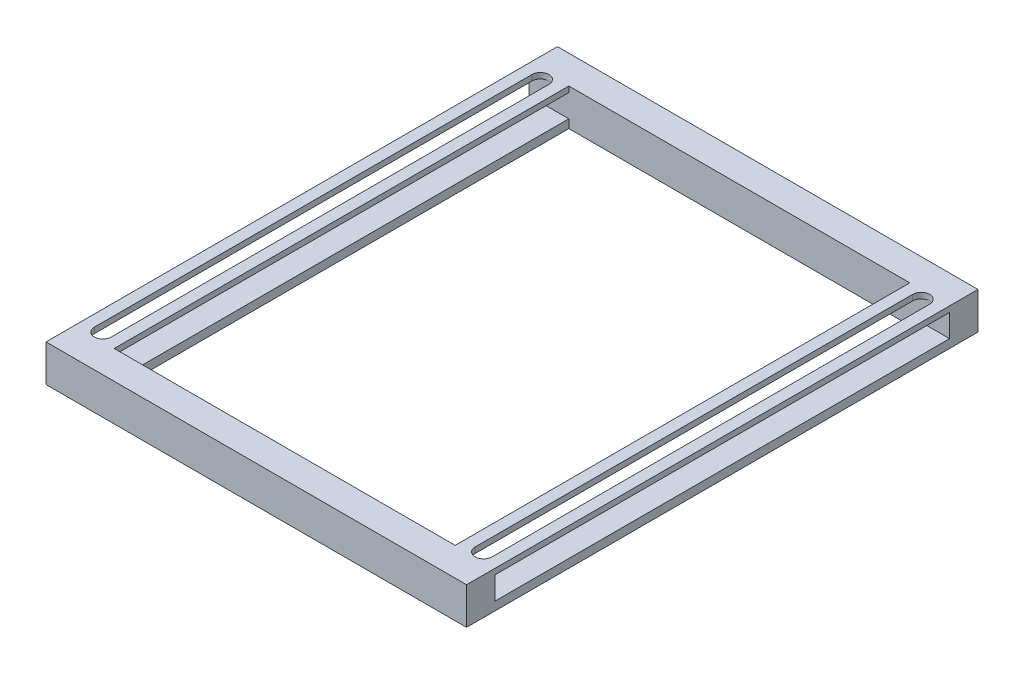
ISO-10303-21;
HEADER;
FILE_DESCRIPTION(('STEP AP214'),'2;1');
FILE_NAME('part.step','',(''),(''),'','','');
FILE_SCHEMA(('AUTOMOTIVE_DESIGN { 1 0 10303 214 1 1 1 1 }'));
ENDSEC;
DATA;
#1=APPLICATION_CONTEXT('core data for automotive mechanical design processes');
#2=APPLICATION_PROTOCOL_DEFINITION('international standard','automotive_design',2000,#1);
#3=PRODUCT_CONTEXT('',#1,'mechanical');
#4=PRODUCT('Part','Part','',(#3));
#5=PRODUCT_RELATED_PRODUCT_CATEGORY('part','',(#4));
#6=PRODUCT_DEFINITION_FORMATION('','',#4);
#7=PRODUCT_DEFINITION_CONTEXT('part definition',#1,'design');
#8=PRODUCT_DEFINITION('design','',#6,#7);
#9=PRODUCT_DEFINITION_SHAPE('','',#8);
#10=(LENGTH_UNIT() NAMED_UNIT(*) SI_UNIT(.MILLI.,.METRE.));
#11=(NAMED_UNIT(*) PLANE_ANGLE_UNIT() SI_UNIT($,.RADIAN.));
#12=(NAMED_UNIT(*) SI_UNIT($,.STERADIAN.) SOLID_ANGLE_UNIT());
#13=UNCERTAINTY_MEASURE_WITH_UNIT(LENGTH_MEASURE(1.E-05),#10,'distance_accuracy_value','');
#14=(GEOMETRIC_REPRESENTATION_CONTEXT(3) GLOBAL_UNCERTAINTY_ASSIGNED_CONTEXT((#13)) GLOBAL_UNIT_ASSIGNED_CONTEXT((#10,
#11,#12)) REPRESENTATION_CONTEXT('',''));
#15=CARTESIAN_POINT('',(0.,0.,0.));
#16=DIRECTION('',(0.,0.,1.));
#17=DIRECTION('',(1.,0.,0.));
#18=AXIS2_PLACEMENT_3D('',#15,#16,#17);
#19=CARTESIAN_POINT('',(0.,-3.,0.));
#20=DIRECTION('',(0.,1.,0.));
#21=DIRECTION('',(0.,0.,1.));
#22=AXIS2_PLACEMENT_3D('',#19,#20,#21);
#23=PLANE('',#22);
#24=DIRECTION('',(-1.,0.,0.));
#25=VECTOR('',#24,1.);
#26=CARTESIAN_POINT('',(158.404053839008,-3.,-6.54809358752482));
#27=LINE('',#26,#25);
#28=CARTESIAN_POINT('',(159.40405383901,-3.,-6.54809358752166));
#29=VERTEX_POINT('',#28);
#30=CARTESIAN_POINT('',(11.4040538390096,-3.,-6.54809358752166));
#31=VERTEX_POINT('',#30);
#32=EDGE_CURVE('E423',#29,#31,#27,.T.);
#33=ORIENTED_EDGE('',*,*,#32,.T.);
#34=DIRECTION('',(0.,0.,1.));
#35=VECTOR('',#34,1.);
#36=CARTESIAN_POINT('',(11.4040538390096,-3.,0.));
#37=LINE('',#36,#35);
#38=CARTESIAN_POINT('',(11.4040538390089,-3.,-186.548093587522));
#39=VERTEX_POINT('',#38);
#40=EDGE_CURVE('E400',#39,#31,#37,.T.);
#41=ORIENTED_EDGE('',*,*,#40,.F.);
#42=DIRECTION('',(-1.,0.,0.));
#43=VECTOR('',#42,1.);
#44=CARTESIAN_POINT('',(158.404053839008,-3.,-186.548093587522));
#45=LINE('',#44,#43);
#46=CARTESIAN_POINT('',(159.40405383901,-3.,-186.548093587522));
#47=VERTEX_POINT('',#46);
#48=EDGE_CURVE('E416',#47,#39,#45,.T.);
#49=ORIENTED_EDGE('',*,*,#48,.F.);
#50=DIRECTION('',(0.,0.,-1.));
#51=VECTOR('',#50,1.);
#52=CARTESIAN_POINT('',(159.40405383901,-3.,0.));
#53=LINE('',#52,#51);
#54=EDGE_CURVE('E367',#29,#47,#53,.T.);
#55=ORIENTED_EDGE('',*,*,#54,.F.);
#56=EDGE_LOOP('',(#33,#41,#49,#55));
#57=FACE_BOUND('',#56,.T.);
#58=DIRECTION('',(0.,0.,1.));
#59=VECTOR('',#58,1.);
#60=CARTESIAN_POINT('',(145.40405383901,-3.,-176.548093587522));
#61=LINE('',#60,#59);
#62=CARTESIAN_POINT('',(145.40405383901,-3.,-176.548093587522));
#63=VERTEX_POINT('',#62);
#64=CARTESIAN_POINT('',(145.40405383901,-3.,-16.5480935875216));
#65=VERTEX_POINT('',#64);
#66=EDGE_CURVE('E356',#63,#65,#61,.T.);
#67=ORIENTED_EDGE('',*,*,#66,.F.);
#68=DIRECTION('',(-1.,0.,0.));
#69=VECTOR('',#68,1.);
#70=CARTESIAN_POINT('',(146.404053839008,-3.,-176.548093587522));
#71=LINE('',#70,#69);
#72=CARTESIAN_POINT('',(25.4040538390096,-3.,-176.548093587522));
#73=VERTEX_POINT('',#72);
#74=EDGE_CURVE('E418',#63,#73,#71,.T.);
#75=ORIENTED_EDGE('',*,*,#74,.T.);
#76=DIRECTION('',(0.,0.,-1.));
#77=VECTOR('',#76,1.);
#78=CARTESIAN_POINT('',(25.4040538390096,-3.,-16.5480935875217));
#79=LINE('',#78,#77);
#80=CARTESIAN_POINT('',(25.4040538390096,-3.,-16.5480935875217));
#81=VERTEX_POINT('',#80);
#82=EDGE_CURVE('E333',#81,#73,#79,.T.);
#83=ORIENTED_EDGE('',*,*,#82,.F.);
#84=DIRECTION('',(-1.,0.,0.));
#85=VECTOR('',#84,1.);
#86=CARTESIAN_POINT('',(158.404053839008,-3.,-16.5480935875217));
#87=LINE('',#86,#85);
#88=EDGE_CURVE('E421',#65,#81,#87,.T.);
#89=ORIENTED_EDGE('',*,*,#88,.F.);
#90=EDGE_LOOP('',(#67,#75,#83,#89));
#91=FACE_BOUND('',#90,.T.);
#92=DIRECTION('',(-1.,0.,0.));
#93=VECTOR('',#92,1.);
#94=CARTESIAN_POINT('',(20.9040538390079,-3.,-41.5480935875434));
#95=LINE('',#94,#93);
#96=CARTESIAN_POINT('',(20.9040538390079,-3.,-41.5480935875434));
#97=VERTEX_POINT('',#96);
#98=CARTESIAN_POINT('',(15.9040538390079,-3.,-41.5480935875434));
#99=VERTEX_POINT('',#98);
#100=EDGE_CURVE('E301',#97,#99,#95,.T.);
#101=ORIENTED_EDGE('',*,*,#100,.F.);
#102=DIRECTION('',(0.,0.,-1.));
#103=VECTOR('',#102,1.);
#104=CARTESIAN_POINT('',(20.9040538390079,-3.,-41.5480935875434));
#105=LINE('',#104,#103);
#106=CARTESIAN_POINT('',(20.9040538390079,-3.,-151.548093587559));
#107=VERTEX_POINT('',#106);
#108=EDGE_CURVE('E282',#97,#107,#105,.T.);
#109=ORIENTED_EDGE('',*,*,#108,.T.);
#110=DIRECTION('',(-1.,0.,0.));
#111=VECTOR('',#110,1.);
#112=CARTESIAN_POINT('',(20.9040538390079,-3.,-151.548093587559));
#113=LINE('',#112,#111);
#114=CARTESIAN_POINT('',(15.9040538390079,-3.,-151.548093587559));
#115=VERTEX_POINT('',#114);
#116=EDGE_CURVE('E285',#107,#115,#113,.T.);
#117=ORIENTED_EDGE('',*,*,#116,.T.);
#118=DIRECTION('',(0.,0.,-1.));
#119=VECTOR('',#118,1.);
#120=CARTESIAN_POINT('',(15.9040538390079,-3.,-41.5480935875434));
#121=LINE('',#120,#119);
#122=EDGE_CURVE('E60',#99,#115,#121,.T.);
#123=ORIENTED_EDGE('',*,*,#122,.F.);
#124=EDGE_LOOP('',(#101,#109,#117,#123));
#125=FACE_BOUND('',#124,.T.);
#126=DIRECTION('',(0.,0.,1.));
#127=VECTOR('',#126,1.);
#128=CARTESIAN_POINT('',(154.904053839023,-3.,-151.548093587559));
#129=LINE('',#128,#127);
#130=CARTESIAN_POINT('',(154.904053839023,-3.,-151.548093587559));
#131=VERTEX_POINT('',#130);
#132=CARTESIAN_POINT('',(154.904053839023,-3.,-41.5480935875434));
#133=VERTEX_POINT('',#132);
#134=EDGE_CURVE('E265',#131,#133,#129,.T.);
#135=ORIENTED_EDGE('',*,*,#134,.F.);
#136=DIRECTION('',(-1.,0.,0.));
#137=VECTOR('',#136,1.);
#138=CARTESIAN_POINT('',(154.904053839023,-3.,-151.548093587559));
#139=LINE('',#138,#137);
#140=CARTESIAN_POINT('',(149.904053839023,-3.,-151.548093587559));
#141=VERTEX_POINT('',#140);
#142=EDGE_CURVE('E276',#131,#141,#139,.T.);
#143=ORIENTED_EDGE('',*,*,#142,.T.);
#144=DIRECTION('',(0.,0.,1.));
#145=VECTOR('',#144,1.);
#146=CARTESIAN_POINT('',(149.904053839023,-3.,-151.548093587559));
#147=LINE('',#146,#145);
#148=CARTESIAN_POINT('',(149.904053839023,-3.,-41.5480935875434));
#149=VERTEX_POINT('',#148);
#150=EDGE_CURVE('E52',#141,#149,#147,.T.);
#151=ORIENTED_EDGE('',*,*,#150,.T.);
#152=DIRECTION('',(-1.,0.,0.));
#153=VECTOR('',#152,1.);
#154=CARTESIAN_POINT('',(154.904053839023,-3.,-41.5480935875434));
#155=LINE('',#154,#153);
#156=EDGE_CURVE('E281',#133,#149,#155,.T.);
#157=ORIENTED_EDGE('',*,*,#156,.F.);
#158=EDGE_LOOP('',(#135,#143,#151,#157));
#159=FACE_BOUND('',#158,.T.);
#160=ADVANCED_FACE('F37',(#57,#91,#125,#159),#23,.F.);
#161=CARTESIAN_POINT('',(24.4040538390096,10.,-16.5480935875217));
#162=DIRECTION('',(0.,0.,-1.));
#163=DIRECTION('',(-1.,0.,0.));
#164=AXIS2_PLACEMENT_3D('',#161,#162,#163);
#165=PLANE('',#164);
#166=DIRECTION('',(1.,0.,0.));
#167=VECTOR('',#166,1.);
#168=CARTESIAN_POINT('',(-41.5959461609905,8.,-16.5480935875217));
#169=LINE('',#168,#167);
#170=CARTESIAN_POINT('',(18.4040538390095,8.,-16.5480935875217));
#171=VERTEX_POINT('',#170);
#172=CARTESIAN_POINT('',(25.4040538390096,8.,-16.5480935875217));
#173=VERTEX_POINT('',#172);
#174=EDGE_CURVE('E617',#171,#173,#169,.T.);
#175=ORIENTED_EDGE('',*,*,#174,.T.);
#176=DIRECTION('',(0.,-1.,0.));
#177=VECTOR('',#176,1.);
#178=CARTESIAN_POINT('',(25.4040538390096,10.,-16.5480935875217));
#179=LINE('',#178,#177);
#180=CARTESIAN_POINT('',(25.4040538390096,10.,-16.5480935875217));
#181=VERTEX_POINT('',#180);
#182=EDGE_CURVE('E327',#181,#173,#179,.T.);
#183=ORIENTED_EDGE('',*,*,#182,.F.);
#184=DIRECTION('',(1.,0.,0.));
#185=VECTOR('',#184,1.);
#186=CARTESIAN_POINT('',(24.4040538390096,10.,-16.5480935875217));
#187=LINE('',#186,#185);
#188=CARTESIAN_POINT('',(145.40405383901,10.,-16.5480935875217));
#189=VERTEX_POINT('',#188);
#190=EDGE_CURVE('E504',#181,#189,#187,.T.);
#191=ORIENTED_EDGE('',*,*,#190,.T.);
#192=DIRECTION('',(0.,1.,0.));
#193=VECTOR('',#192,1.);
#194=CARTESIAN_POINT('',(145.40405383901,8.,-16.5480935875217));
#195=LINE('',#194,#193);
#196=CARTESIAN_POINT('',(145.40405383901,8.,-16.5480935875217));
#197=VERTEX_POINT('',#196);
#198=EDGE_CURVE('E344',#197,#189,#195,.T.);
#199=ORIENTED_EDGE('',*,*,#198,.F.);
#200=CARTESIAN_POINT('',(152.40405383901,8.,-16.5480935875217));
#201=VERTEX_POINT('',#200);
#202=EDGE_CURVE('E435',#197,#201,#169,.T.);
#203=ORIENTED_EDGE('',*,*,#202,.T.);
#204=CARTESIAN_POINT('',(159.40405383901,8.,-16.5480935875217));
#205=VERTEX_POINT('',#204);
#206=EDGE_CURVE('E433',#201,#205,#169,.T.);
#207=ORIENTED_EDGE('',*,*,#206,.T.);
#208=DIRECTION('',(0.,-1.,0.));
#209=VECTOR('',#208,1.);
#210=CARTESIAN_POINT('',(159.40405383901,0.,-16.5480935875217));
#211=LINE('',#210,#209);
#212=CARTESIAN_POINT('',(159.40405383901,0.,-16.5480935875217));
#213=VERTEX_POINT('',#212);
#214=EDGE_CURVE('E379',#205,#213,#211,.T.);
#215=ORIENTED_EDGE('',*,*,#214,.T.);
#216=DIRECTION('',(-1.,0.,0.));
#217=VECTOR('',#216,1.);
#218=CARTESIAN_POINT('',(158.40405383901,0.,-16.5480935875216));
#219=LINE('',#218,#217);
#220=CARTESIAN_POINT('',(145.40405383901,0.,-16.5480935875217));
#221=VERTEX_POINT('',#220);
#222=EDGE_CURVE('E414',#213,#221,#219,.T.);
#223=ORIENTED_EDGE('',*,*,#222,.T.);
#224=DIRECTION('',(0.,1.,0.));
#225=VECTOR('',#224,1.);
#226=CARTESIAN_POINT('',(145.40405383901,-3.,-16.5480935875216));
#227=LINE('',#226,#225);
#228=EDGE_CURVE('E358',#65,#221,#227,.T.);
#229=ORIENTED_EDGE('',*,*,#228,.F.);
#230=ORIENTED_EDGE('',*,*,#88,.T.);
#231=DIRECTION('',(0.,-1.,0.));
#232=VECTOR('',#231,1.);
#233=CARTESIAN_POINT('',(25.4040538390096,0.,-16.5480935875217));
#234=LINE('',#233,#232);
#235=CARTESIAN_POINT('',(25.4040538390096,0.,-16.5480935875217));
#236=VERTEX_POINT('',#235);
#237=EDGE_CURVE('E330',#236,#81,#234,.T.);
#238=ORIENTED_EDGE('',*,*,#237,.F.);
#239=DIRECTION('',(1.,0.,0.));
#240=VECTOR('',#239,1.);
#241=CARTESIAN_POINT('',(12.4040538390096,0.,-16.5480935875217));
#242=LINE('',#241,#240);
#243=CARTESIAN_POINT('',(11.4040538390095,0.,-16.5480935875217));
#244=VERTEX_POINT('',#243);
#245=EDGE_CURVE('E412',#244,#236,#242,.T.);
#246=ORIENTED_EDGE('',*,*,#245,.F.);
#247=DIRECTION('',(0.,-1.,0.));
#248=VECTOR('',#247,1.);
#249=CARTESIAN_POINT('',(11.4040538390095,0.,-16.5480935875217));
#250=LINE('',#249,#248);
#251=CARTESIAN_POINT('',(11.4040538390095,8.,-16.5480935875217));
#252=VERTEX_POINT('',#251);
#253=EDGE_CURVE('E388',#252,#244,#250,.T.);
#254=ORIENTED_EDGE('',*,*,#253,.F.);
#255=EDGE_CURVE('E431',#252,#171,#169,.T.);
#256=ORIENTED_EDGE('',*,*,#255,.T.);
#257=EDGE_LOOP('',(#175,#183,#191,#199,#203,#207,#215,#223,#229,#230,#238,#246,#254,#256));
#258=FACE_BOUND('',#257,.T.);
#259=ADVANCED_FACE('F537',(#258),#165,.T.);
#260=CARTESIAN_POINT('',(24.4040538390096,10.,-176.548093587522));
#261=DIRECTION('',(0.,0.,1.));
#262=DIRECTION('',(1.,0.,0.));
#263=AXIS2_PLACEMENT_3D('',#260,#261,#262);
#264=PLANE('',#263);
#265=DIRECTION('',(0.,1.,0.));
#266=VECTOR('',#265,1.);
#267=CARTESIAN_POINT('',(25.4040538390096,8.,-176.548093587522));
#268=LINE('',#267,#266);
#269=CARTESIAN_POINT('',(25.4040538390096,8.,-176.548093587522));
#270=VERTEX_POINT('',#269);
#271=CARTESIAN_POINT('',(25.4040538390096,10.,-176.548093587522));
#272=VERTEX_POINT('',#271);
#273=EDGE_CURVE('E322',#270,#272,#268,.T.);
#274=ORIENTED_EDGE('',*,*,#273,.F.);
#275=DIRECTION('',(1.,0.,0.));
#276=VECTOR('',#275,1.);
#277=CARTESIAN_POINT('',(-41.5959461609905,8.,-176.548093587522));
#278=LINE('',#277,#276);
#279=CARTESIAN_POINT('',(18.4040538390093,8.,-176.548093587522));
#280=VERTEX_POINT('',#279);
#281=EDGE_CURVE('E596',#280,#270,#278,.T.);
#282=ORIENTED_EDGE('',*,*,#281,.F.);
#283=CARTESIAN_POINT('',(11.404053839009,8.,-176.548093587522));
#284=VERTEX_POINT('',#283);
#285=EDGE_CURVE('E432',#284,#280,#278,.T.);
#286=ORIENTED_EDGE('',*,*,#285,.F.);
#287=DIRECTION('',(0.,-1.,0.));
#288=VECTOR('',#287,1.);
#289=CARTESIAN_POINT('',(11.404053839009,-3.76937997027968E-13,-176.548093587522));
#290=LINE('',#289,#288);
#291=CARTESIAN_POINT('',(11.404053839009,0.,-176.548093587522));
#292=VERTEX_POINT('',#291);
#293=EDGE_CURVE('E394',#284,#292,#290,.T.);
#294=ORIENTED_EDGE('',*,*,#293,.T.);
#295=DIRECTION('',(-1.,0.,0.));
#296=VECTOR('',#295,1.);
#297=CARTESIAN_POINT('',(212.404053839009,0.,-176.548093587522));
#298=LINE('',#297,#296);
#299=CARTESIAN_POINT('',(25.4040538390096,0.,-176.548093587522));
#300=VERTEX_POINT('',#299);
#301=EDGE_CURVE('E425',#300,#292,#298,.T.);
#302=ORIENTED_EDGE('',*,*,#301,.F.);
#303=DIRECTION('',(0.,1.,0.));
#304=VECTOR('',#303,1.);
#305=CARTESIAN_POINT('',(25.4040538390096,-3.,-176.548093587522));
#306=LINE('',#305,#304);
#307=EDGE_CURVE('E336',#73,#300,#306,.T.);
#308=ORIENTED_EDGE('',*,*,#307,.F.);
#309=ORIENTED_EDGE('',*,*,#74,.F.);
#310=DIRECTION('',(0.,-1.,0.));
#311=VECTOR('',#310,1.);
#312=CARTESIAN_POINT('',(145.40405383901,0.,-176.548093587522));
#313=LINE('',#312,#311);
#314=CARTESIAN_POINT('',(145.40405383901,0.,-176.548093587522));
#315=VERTEX_POINT('',#314);
#316=EDGE_CURVE('E353',#315,#63,#313,.T.);
#317=ORIENTED_EDGE('',*,*,#316,.F.);
#318=CARTESIAN_POINT('',(159.40405383901,0.,-176.548093587522));
#319=VERTEX_POINT('',#318);
#320=EDGE_CURVE('E427',#319,#315,#298,.T.);
#321=ORIENTED_EDGE('',*,*,#320,.F.);
#322=DIRECTION('',(0.,-1.,0.));
#323=VECTOR('',#322,1.);
#324=CARTESIAN_POINT('',(159.40405383901,0.,-176.548093587522));
#325=LINE('',#324,#323);
#326=CARTESIAN_POINT('',(159.40405383901,8.,-176.548093587522));
#327=VERTEX_POINT('',#326);
#328=EDGE_CURVE('E385',#327,#319,#325,.T.);
#329=ORIENTED_EDGE('',*,*,#328,.F.);
#330=CARTESIAN_POINT('',(152.404053839009,8.,-176.548093587522));
#331=VERTEX_POINT('',#330);
#332=EDGE_CURVE('E428',#331,#327,#278,.T.);
#333=ORIENTED_EDGE('',*,*,#332,.F.);
#334=CARTESIAN_POINT('',(145.40405383901,8.,-176.548093587522));
#335=VERTEX_POINT('',#334);
#336=EDGE_CURVE('E430',#335,#331,#278,.T.);
#337=ORIENTED_EDGE('',*,*,#336,.F.);
#338=DIRECTION('',(0.,-1.,0.));
#339=VECTOR('',#338,1.);
#340=CARTESIAN_POINT('',(145.40405383901,10.,-176.548093587522));
#341=LINE('',#340,#339);
#342=CARTESIAN_POINT('',(145.40405383901,10.,-176.548093587522));
#343=VERTEX_POINT('',#342);
#344=EDGE_CURVE('E350',#343,#335,#341,.T.);
#345=ORIENTED_EDGE('',*,*,#344,.F.);
#346=DIRECTION('',(-1.,0.,0.));
#347=VECTOR('',#346,1.);
#348=CARTESIAN_POINT('',(24.4040538390096,10.,-176.548093587522));
#349=LINE('',#348,#347);
#350=EDGE_CURVE('E478',#343,#272,#349,.T.);
#351=ORIENTED_EDGE('',*,*,#350,.T.);
#352=EDGE_LOOP('',(#274,#282,#286,#294,#302,#308,#309,#317,#321,#329,#333,#337,#345,#351));
#353=FACE_BOUND('',#352,.T.);
#354=ADVANCED_FACE('F533',(#353),#264,.T.);
#355=CARTESIAN_POINT('',(0.,10.,0.));
#356=DIRECTION('',(0.,1.,0.));
#357=DIRECTION('',(0.,0.,1.));
#358=AXIS2_PLACEMENT_3D('',#355,#356,#357);
#359=PLANE('',#358);
#360=ORIENTED_EDGE('',*,*,#190,.F.);
#361=DIRECTION('',(0.,0.,1.));
#362=VECTOR('',#361,1.);
#363=CARTESIAN_POINT('',(25.4040538390096,10.,-176.548093587522));
#364=LINE('',#363,#362);
#365=EDGE_CURVE('E315',#272,#181,#364,.T.);
#366=ORIENTED_EDGE('',*,*,#365,.F.);
#367=ORIENTED_EDGE('',*,*,#350,.F.);
#368=DIRECTION('',(0.,0.,-1.));
#369=VECTOR('',#368,1.);
#370=CARTESIAN_POINT('',(145.40405383901,10.,-16.5480935875217));
#371=LINE('',#370,#369);
#372=EDGE_CURVE('E342',#189,#343,#371,.T.);
#373=ORIENTED_EDGE('',*,*,#372,.F.);
#374=EDGE_LOOP('',(#360,#366,#367,#373));
#375=FACE_BOUND('',#374,.T.);
#376=CARTESIAN_POINT('',(18.4040538390093,10.,-173.548093587522));
#377=DIRECTION('',(0.,1.,0.));
#378=DIRECTION('',(0.,0.,1.));
#379=AXIS2_PLACEMENT_3D('',#376,#377,#378);
#380=CIRCLE('',#379,3.);
#381=CARTESIAN_POINT('',(21.4040538390093,10.,-173.548093587522));
#382=VERTEX_POINT('',#381);
#383=CARTESIAN_POINT('',(15.4040538390093,10.,-173.548093587522));
#384=VERTEX_POINT('',#383);
#385=EDGE_CURVE('E462',#382,#384,#380,.T.);
#386=ORIENTED_EDGE('',*,*,#385,.F.);
#387=DIRECTION('',(0.,0.,-1.));
#388=VECTOR('',#387,1.);
#389=CARTESIAN_POINT('',(21.4040538390093,10.,-173.548093587522));
#390=LINE('',#389,#388);
#391=CARTESIAN_POINT('',(21.4040538390093,10.,-19.5480935875217));
#392=VERTEX_POINT('',#391);
#393=EDGE_CURVE('E472',#392,#382,#390,.T.);
#394=ORIENTED_EDGE('',*,*,#393,.F.);
#395=CARTESIAN_POINT('',(18.4040538390095,10.,-19.5480935875217));
#396=DIRECTION('',(0.,1.,0.));
#397=DIRECTION('',(0.,0.,1.));
#398=AXIS2_PLACEMENT_3D('',#395,#396,#397);
#399=CIRCLE('',#398,3.);
#400=CARTESIAN_POINT('',(15.4040538390095,10.,-19.5480935875217));
#401=VERTEX_POINT('',#400);
#402=EDGE_CURVE('E469',#401,#392,#399,.T.);
#403=ORIENTED_EDGE('',*,*,#402,.F.);
#404=DIRECTION('',(0.,0.,1.));
#405=VECTOR('',#404,1.);
#406=CARTESIAN_POINT('',(15.4040538390093,10.,-173.548093587522));
#407=LINE('',#406,#405);
#408=EDGE_CURVE('E465',#384,#401,#407,.T.);
#409=ORIENTED_EDGE('',*,*,#408,.F.);
#410=EDGE_LOOP('',(#386,#394,#403,#409));
#411=FACE_BOUND('',#410,.T.);
#412=CARTESIAN_POINT('',(152.404053839009,10.,-173.548093587522));
#413=DIRECTION('',(0.,1.,0.));
#414=DIRECTION('',(0.,0.,1.));
#415=AXIS2_PLACEMENT_3D('',#412,#413,#414);
#416=CIRCLE('',#415,3.);
#417=CARTESIAN_POINT('',(155.404053839009,10.,-173.548093587522));
#418=VERTEX_POINT('',#417);
#419=CARTESIAN_POINT('',(149.404053839009,10.,-173.548093587522));
#420=VERTEX_POINT('',#419);
#421=EDGE_CURVE('E461',#418,#420,#416,.T.);
#422=ORIENTED_EDGE('',*,*,#421,.F.);
#423=DIRECTION('',(0.,0.,-1.));
#424=VECTOR('',#423,1.);
#425=CARTESIAN_POINT('',(155.404053839009,10.,-173.548093587522));
#426=LINE('',#425,#424);
#427=CARTESIAN_POINT('',(155.404053839009,10.,-19.5480935875217));
#428=VERTEX_POINT('',#427);
#429=EDGE_CURVE('E492',#428,#418,#426,.T.);
#430=ORIENTED_EDGE('',*,*,#429,.F.);
#431=CARTESIAN_POINT('',(152.40405383901,10.,-19.5480935875217));
#432=DIRECTION('',(0.,1.,0.));
#433=DIRECTION('',(0.,0.,1.));
#434=AXIS2_PLACEMENT_3D('',#431,#432,#433);
#435=CIRCLE('',#434,3.);
#436=CARTESIAN_POINT('',(149.40405383901,10.,-19.5480935875217));
#437=VERTEX_POINT('',#436);
#438=EDGE_CURVE('E489',#437,#428,#435,.T.);
#439=ORIENTED_EDGE('',*,*,#438,.F.);
#440=DIRECTION('',(0.,0.,1.));
#441=VECTOR('',#440,1.);
#442=CARTESIAN_POINT('',(149.404053839009,10.,-173.548093587522));
#443=LINE('',#442,#441);
#444=EDGE_CURVE('E486',#420,#437,#443,.T.);
#445=ORIENTED_EDGE('',*,*,#444,.F.);
#446=EDGE_LOOP('',(#422,#430,#439,#445));
#447=FACE_BOUND('',#446,.T.);
#448=DIRECTION('',(1.,0.,0.));
#449=VECTOR('',#448,1.);
#450=CARTESIAN_POINT('',(12.4040538390096,10.,-6.54809358752166));
#451=LINE('',#450,#449);
#452=CARTESIAN_POINT('',(11.4040538390096,10.,-6.54809358752166));
#453=VERTEX_POINT('',#452);
#454=CARTESIAN_POINT('',(159.40405383901,10.,-6.54809358752166));
#455=VERTEX_POINT('',#454);
#456=EDGE_CURVE('E506',#453,#455,#451,.T.);
#457=ORIENTED_EDGE('',*,*,#456,.T.);
#458=DIRECTION('',(0.,0.,1.));
#459=VECTOR('',#458,1.);
#460=CARTESIAN_POINT('',(159.40405383901,10.,0.));
#461=LINE('',#460,#459);
#462=CARTESIAN_POINT('',(159.40405383901,10.,-186.548093587522));
#463=VERTEX_POINT('',#462);
#464=EDGE_CURVE('E373',#463,#455,#461,.T.);
#465=ORIENTED_EDGE('',*,*,#464,.F.);
#466=DIRECTION('',(-1.,0.,0.));
#467=VECTOR('',#466,1.);
#468=CARTESIAN_POINT('',(12.4040538390089,10.,-186.548093587522));
#469=LINE('',#468,#467);
#470=CARTESIAN_POINT('',(11.4040538390089,10.,-186.548093587522));
#471=VERTEX_POINT('',#470);
#472=EDGE_CURVE('E45',#463,#471,#469,.T.);
#473=ORIENTED_EDGE('',*,*,#472,.T.);
#474=DIRECTION('',(0.,0.,-1.));
#475=VECTOR('',#474,1.);
#476=CARTESIAN_POINT('',(11.4040538390096,10.,0.));
#477=LINE('',#476,#475);
#478=EDGE_CURVE('E406',#453,#471,#477,.T.);
#479=ORIENTED_EDGE('',*,*,#478,.F.);
#480=EDGE_LOOP('',(#457,#465,#473,#479));
#481=FACE_BOUND('',#480,.T.);
#482=ADVANCED_FACE('F510',(#375,#411,#447,#481),#359,.T.);
#483=CARTESIAN_POINT('',(12.4040538390096,10.,-6.54809358752166));
#484=DIRECTION('',(0.,0.,-1.));
#485=DIRECTION('',(-1.,0.,0.));
#486=AXIS2_PLACEMENT_3D('',#483,#484,#485);
#487=PLANE('',#486);
#488=ORIENTED_EDGE('',*,*,#456,.F.);
#489=DIRECTION('',(0.,1.,0.));
#490=VECTOR('',#489,1.);
#491=CARTESIAN_POINT('',(11.4040538390096,0.,-6.54809358752166));
#492=LINE('',#491,#490);
#493=EDGE_CURVE('E403',#31,#453,#492,.T.);
#494=ORIENTED_EDGE('',*,*,#493,.F.);
#495=ORIENTED_EDGE('',*,*,#32,.F.);
#496=DIRECTION('',(0.,-1.,0.));
#497=VECTOR('',#496,1.);
#498=CARTESIAN_POINT('',(159.40405383901,0.,-6.54809358752166));
#499=LINE('',#498,#497);
#500=EDGE_CURVE('E364',#455,#29,#499,.T.);
#501=ORIENTED_EDGE('',*,*,#500,.F.);
#502=EDGE_LOOP('',(#488,#494,#495,#501));
#503=FACE_BOUND('',#502,.T.);
#504=ADVANCED_FACE('F39',(#503),#487,.F.);
#505=CARTESIAN_POINT('',(12.4040538390089,10.,-186.548093587522));
#506=DIRECTION('',(0.,0.,1.));
#507=DIRECTION('',(1.,0.,0.));
#508=AXIS2_PLACEMENT_3D('',#505,#506,#507);
#509=PLANE('',#508);
#510=ORIENTED_EDGE('',*,*,#472,.F.);
#511=DIRECTION('',(0.,1.,0.));
#512=VECTOR('',#511,1.);
#513=CARTESIAN_POINT('',(159.40405383901,0.,-186.548093587522));
#514=LINE('',#513,#512);
#515=EDGE_CURVE('E370',#47,#463,#514,.T.);
#516=ORIENTED_EDGE('',*,*,#515,.F.);
#517=ORIENTED_EDGE('',*,*,#48,.T.);
#518=DIRECTION('',(0.,-1.,0.));
#519=VECTOR('',#518,1.);
#520=CARTESIAN_POINT('',(11.4040538390089,0.,-186.548093587522));
#521=LINE('',#520,#519);
#522=EDGE_CURVE('E409',#471,#39,#521,.T.);
#523=ORIENTED_EDGE('',*,*,#522,.F.);
#524=EDGE_LOOP('',(#510,#516,#517,#523));
#525=FACE_BOUND('',#524,.T.);
#526=ADVANCED_FACE('F518',(#525),#509,.F.);
#527=CARTESIAN_POINT('',(152.404053839009,2.,-173.548093587522));
#528=DIRECTION('',(0.,1.,0.));
#529=DIRECTION('',(0.,0.,1.));
#530=AXIS2_PLACEMENT_3D('',#527,#528,#529);
#531=CYLINDRICAL_SURFACE('',#530,3.);
#532=CARTESIAN_POINT('',(152.404053839009,8.,-173.548093587522));
#533=DIRECTION('',(0.,1.,0.));
#534=DIRECTION('',(0.,0.,1.));
#535=AXIS2_PLACEMENT_3D('',#532,#533,#534);
#536=CIRCLE('',#535,3.);
#537=CARTESIAN_POINT('',(149.404053839009,8.,-173.548093587522));
#538=VERTEX_POINT('',#537);
#539=EDGE_CURVE('E453',#538,#331,#536,.F.);
#540=ORIENTED_EDGE('',*,*,#539,.T.);
#541=CARTESIAN_POINT('',(155.404053839009,8.,-173.548093587522));
#542=VERTEX_POINT('',#541);
#543=EDGE_CURVE('E457',#331,#542,#536,.F.);
#544=ORIENTED_EDGE('',*,*,#543,.T.);
#545=DIRECTION('',(0.,1.,0.));
#546=VECTOR('',#545,1.);
#547=CARTESIAN_POINT('',(155.404053839009,2.,-173.548093587522));
#548=LINE('',#547,#546);
#549=EDGE_CURVE('E466',#542,#418,#548,.T.);
#550=ORIENTED_EDGE('',*,*,#549,.T.);
#551=ORIENTED_EDGE('',*,*,#421,.T.);
#552=DIRECTION('',(0.,1.,0.));
#553=VECTOR('',#552,1.);
#554=CARTESIAN_POINT('',(149.404053839009,2.,-173.548093587522));
#555=LINE('',#554,#553);
#556=EDGE_CURVE('E495',#538,#420,#555,.T.);
#557=ORIENTED_EDGE('',*,*,#556,.F.);
#558=EDGE_LOOP('',(#540,#544,#550,#551,#557));
#559=FACE_BOUND('',#558,.T.);
#560=ADVANCED_FACE('F532',(#559),#531,.F.);
#561=CARTESIAN_POINT('',(155.404053839009,2.,-173.548093587522));
#562=DIRECTION('',(1.,0.,0.));
#563=DIRECTION('',(0.,0.,-1.));
#564=AXIS2_PLACEMENT_3D('',#561,#562,#563);
#565=PLANE('',#564);
#566=ORIENTED_EDGE('',*,*,#549,.F.);
#567=DIRECTION('',(0.,0.,1.));
#568=VECTOR('',#567,1.);
#569=CARTESIAN_POINT('',(155.404053839009,8.,-173.548093587522));
#570=LINE('',#569,#568);
#571=CARTESIAN_POINT('',(155.40405383901,8.,-19.5480935875217));
#572=VERTEX_POINT('',#571);
#573=EDGE_CURVE('E458',#542,#572,#570,.T.);
#574=ORIENTED_EDGE('',*,*,#573,.T.);
#575=DIRECTION('',(0.,1.,0.));
#576=VECTOR('',#575,1.);
#577=CARTESIAN_POINT('',(155.404053839009,2.,-19.5480935875217));
#578=LINE('',#577,#576);
#579=EDGE_CURVE('E497',#572,#428,#578,.T.);
#580=ORIENTED_EDGE('',*,*,#579,.T.);
#581=ORIENTED_EDGE('',*,*,#429,.T.);
#582=EDGE_LOOP('',(#566,#574,#580,#581));
#583=FACE_BOUND('',#582,.T.);
#584=ADVANCED_FACE('F576',(#583),#565,.F.);
#585=CARTESIAN_POINT('',(152.40405383901,2.,-19.5480935875217));
#586=DIRECTION('',(0.,1.,0.));
#587=DIRECTION('',(0.,0.,1.));
#588=AXIS2_PLACEMENT_3D('',#585,#586,#587);
#589=CYLINDRICAL_SURFACE('',#588,3.);
#590=CARTESIAN_POINT('',(152.40405383901,8.,-19.5480935875217));
#591=DIRECTION('',(0.,1.,0.));
#592=DIRECTION('',(0.,0.,1.));
#593=AXIS2_PLACEMENT_3D('',#590,#591,#592);
#594=CIRCLE('',#593,3.);
#595=EDGE_CURVE('E454',#572,#201,#594,.F.);
#596=ORIENTED_EDGE('',*,*,#595,.T.);
#597=CARTESIAN_POINT('',(149.404053839009,8.,-19.5480935875217));
#598=VERTEX_POINT('',#597);
#599=EDGE_CURVE('E450',#201,#598,#594,.F.);
#600=ORIENTED_EDGE('',*,*,#599,.T.);
#601=DIRECTION('',(0.,1.,0.));
#602=VECTOR('',#601,1.);
#603=CARTESIAN_POINT('',(149.40405383901,2.,-19.5480935875217));
#604=LINE('',#603,#602);
#605=EDGE_CURVE('E499',#598,#437,#604,.T.);
#606=ORIENTED_EDGE('',*,*,#605,.T.);
#607=ORIENTED_EDGE('',*,*,#438,.T.);
#608=ORIENTED_EDGE('',*,*,#579,.F.);
#609=EDGE_LOOP('',(#596,#600,#606,#607,#608));
#610=FACE_BOUND('',#609,.T.);
#611=ADVANCED_FACE('F579',(#610),#589,.F.);
#612=CARTESIAN_POINT('',(149.404053839009,2.,-173.548093587522));
#613=DIRECTION('',(-1.,0.,0.));
#614=DIRECTION('',(0.,0.,1.));
#615=AXIS2_PLACEMENT_3D('',#612,#613,#614);
#616=PLANE('',#615);
#617=ORIENTED_EDGE('',*,*,#605,.F.);
#618=DIRECTION('',(0.,0.,-1.));
#619=VECTOR('',#618,1.);
#620=CARTESIAN_POINT('',(149.404053839009,8.,-173.548093587522));
#621=LINE('',#620,#619);
#622=EDGE_CURVE('E447',#598,#538,#621,.T.);
#623=ORIENTED_EDGE('',*,*,#622,.T.);
#624=ORIENTED_EDGE('',*,*,#556,.T.);
#625=ORIENTED_EDGE('',*,*,#444,.T.);
#626=EDGE_LOOP('',(#617,#623,#624,#625));
#627=FACE_BOUND('',#626,.T.);
#628=ADVANCED_FACE('F574',(#627),#616,.F.);
#629=CARTESIAN_POINT('',(18.4040538390093,2.,-173.548093587522));
#630=DIRECTION('',(0.,1.,0.));
#631=DIRECTION('',(0.,0.,1.));
#632=AXIS2_PLACEMENT_3D('',#629,#630,#631);
#633=CYLINDRICAL_SURFACE('',#632,3.);
#634=CARTESIAN_POINT('',(18.4040538390093,8.,-173.548093587522));
#635=DIRECTION('',(0.,1.,0.));
#636=DIRECTION('',(0.,0.,1.));
#637=AXIS2_PLACEMENT_3D('',#634,#635,#636);
#638=CIRCLE('',#637,3.);
#639=CARTESIAN_POINT('',(15.4040538390093,8.,-173.548093587522));
#640=VERTEX_POINT('',#639);
#641=EDGE_CURVE('E439',#640,#280,#638,.F.);
#642=ORIENTED_EDGE('',*,*,#641,.T.);
#643=CARTESIAN_POINT('',(21.4040538390093,8.,-173.548093587522));
#644=VERTEX_POINT('',#643);
#645=EDGE_CURVE('E443',#280,#644,#638,.F.);
#646=ORIENTED_EDGE('',*,*,#645,.T.);
#647=DIRECTION('',(0.,1.,0.));
#648=VECTOR('',#647,1.);
#649=CARTESIAN_POINT('',(21.4040538390093,2.,-173.548093587522));
#650=LINE('',#649,#648);
#651=EDGE_CURVE('E476',#644,#382,#650,.T.);
#652=ORIENTED_EDGE('',*,*,#651,.T.);
#653=ORIENTED_EDGE('',*,*,#385,.T.);
#654=DIRECTION('',(0.,1.,0.));
#655=VECTOR('',#654,1.);
#656=CARTESIAN_POINT('',(15.4040538390093,2.,-173.548093587522));
#657=LINE('',#656,#655);
#658=EDGE_CURVE('E475',#640,#384,#657,.T.);
#659=ORIENTED_EDGE('',*,*,#658,.F.);
#660=EDGE_LOOP('',(#642,#646,#652,#653,#659));
#661=FACE_BOUND('',#660,.T.);
#662=ADVANCED_FACE('F564',(#661),#633,.F.);
#663=CARTESIAN_POINT('',(21.4040538390093,2.,-173.548093587522));
#664=DIRECTION('',(1.,0.,0.));
#665=DIRECTION('',(0.,0.,-1.));
#666=AXIS2_PLACEMENT_3D('',#663,#664,#665);
#667=PLANE('',#666);
#668=ORIENTED_EDGE('',*,*,#651,.F.);
#669=DIRECTION('',(0.,0.,1.));
#670=VECTOR('',#669,1.);
#671=CARTESIAN_POINT('',(21.4040538390093,8.,-173.548093587522));
#672=LINE('',#671,#670);
#673=CARTESIAN_POINT('',(21.4040538390095,8.,-19.5480935875217));
#674=VERTEX_POINT('',#673);
#675=EDGE_CURVE('E444',#644,#674,#672,.T.);
#676=ORIENTED_EDGE('',*,*,#675,.T.);
#677=DIRECTION('',(0.,1.,0.));
#678=VECTOR('',#677,1.);
#679=CARTESIAN_POINT('',(21.4040538390093,2.,-19.5480935875217));
#680=LINE('',#679,#678);
#681=EDGE_CURVE('E479',#674,#392,#680,.T.);
#682=ORIENTED_EDGE('',*,*,#681,.T.);
#683=ORIENTED_EDGE('',*,*,#393,.T.);
#684=EDGE_LOOP('',(#668,#676,#682,#683));
#685=FACE_BOUND('',#684,.T.);
#686=ADVANCED_FACE('F560',(#685),#667,.F.);
#687=CARTESIAN_POINT('',(18.4040538390095,2.,-19.5480935875217));
#688=DIRECTION('',(0.,1.,0.));
#689=DIRECTION('',(0.,0.,1.));
#690=AXIS2_PLACEMENT_3D('',#687,#688,#689);
#691=CYLINDRICAL_SURFACE('',#690,3.);
#692=CARTESIAN_POINT('',(18.4040538390095,8.,-19.5480935875217));
#693=DIRECTION('',(0.,1.,0.));
#694=DIRECTION('',(0.,0.,1.));
#695=AXIS2_PLACEMENT_3D('',#692,#693,#694);
#696=CIRCLE('',#695,3.);
#697=EDGE_CURVE('E440',#674,#171,#696,.F.);
#698=ORIENTED_EDGE('',*,*,#697,.T.);
#699=CARTESIAN_POINT('',(15.4040538390093,8.,-19.5480935875217));
#700=VERTEX_POINT('',#699);
#701=EDGE_CURVE('E436',#171,#700,#696,.F.);
#702=ORIENTED_EDGE('',*,*,#701,.T.);
#703=DIRECTION('',(0.,1.,0.));
#704=VECTOR('',#703,1.);
#705=CARTESIAN_POINT('',(15.4040538390095,2.,-19.5480935875217));
#706=LINE('',#705,#704);
#707=EDGE_CURVE('E481',#700,#401,#706,.T.);
#708=ORIENTED_EDGE('',*,*,#707,.T.);
#709=ORIENTED_EDGE('',*,*,#402,.T.);
#710=ORIENTED_EDGE('',*,*,#681,.F.);
#711=EDGE_LOOP('',(#698,#702,#708,#709,#710));
#712=FACE_BOUND('',#711,.T.);
#713=ADVANCED_FACE('F563',(#712),#691,.F.);
#714=CARTESIAN_POINT('',(15.4040538390093,2.,-173.548093587522));
#715=DIRECTION('',(-1.,0.,0.));
#716=DIRECTION('',(0.,0.,1.));
#717=AXIS2_PLACEMENT_3D('',#714,#715,#716);
#718=PLANE('',#717);
#719=ORIENTED_EDGE('',*,*,#707,.F.);
#720=DIRECTION('',(0.,0.,-1.));
#721=VECTOR('',#720,1.);
#722=CARTESIAN_POINT('',(15.4040538390093,8.,-173.548093587522));
#723=LINE('',#722,#721);
#724=EDGE_CURVE('E11',#700,#640,#723,.T.);
#725=ORIENTED_EDGE('',*,*,#724,.T.);
#726=ORIENTED_EDGE('',*,*,#658,.T.);
#727=ORIENTED_EDGE('',*,*,#408,.T.);
#728=EDGE_LOOP('',(#719,#725,#726,#727));
#729=FACE_BOUND('',#728,.T.);
#730=ADVANCED_FACE('F558',(#729),#718,.F.);
#731=CARTESIAN_POINT('',(-41.5959461609905,8.,-176.548093587522));
#732=DIRECTION('',(0.,1.,0.));
#733=DIRECTION('',(0.,0.,1.));
#734=AXIS2_PLACEMENT_3D('',#731,#732,#733);
#735=PLANE('',#734);
#736=ORIENTED_EDGE('',*,*,#285,.T.);
#737=ORIENTED_EDGE('',*,*,#641,.F.);
#738=ORIENTED_EDGE('',*,*,#724,.F.);
#739=ORIENTED_EDGE('',*,*,#701,.F.);
#740=ORIENTED_EDGE('',*,*,#255,.F.);
#741=DIRECTION('',(0.,0.,1.));
#742=VECTOR('',#741,1.);
#743=CARTESIAN_POINT('',(11.4040538390096,8.,0.));
#744=LINE('',#743,#742);
#745=EDGE_CURVE('E397',#284,#252,#744,.T.);
#746=ORIENTED_EDGE('',*,*,#745,.F.);
#747=EDGE_LOOP('',(#736,#737,#738,#739,#740,#746));
#748=FACE_BOUND('',#747,.T.);
#749=ADVANCED_FACE('F554',(#748),#735,.F.);
#750=ORIENTED_EDGE('',*,*,#281,.T.);
#751=DIRECTION('',(0.,0.,-1.));
#752=VECTOR('',#751,1.);
#753=CARTESIAN_POINT('',(25.4040538390096,8.,-16.5480935875217));
#754=LINE('',#753,#752);
#755=EDGE_CURVE('E324',#173,#270,#754,.T.);
#756=ORIENTED_EDGE('',*,*,#755,.F.);
#757=ORIENTED_EDGE('',*,*,#174,.F.);
#758=ORIENTED_EDGE('',*,*,#697,.F.);
#759=ORIENTED_EDGE('',*,*,#675,.F.);
#760=ORIENTED_EDGE('',*,*,#645,.F.);
#761=EDGE_LOOP('',(#750,#756,#757,#758,#759,#760));
#762=FACE_BOUND('',#761,.T.);
#763=ADVANCED_FACE('F557',(#762),#735,.F.);
#764=ORIENTED_EDGE('',*,*,#543,.F.);
#765=ORIENTED_EDGE('',*,*,#332,.T.);
#766=DIRECTION('',(0.,0.,-1.));
#767=VECTOR('',#766,1.);
#768=CARTESIAN_POINT('',(159.40405383901,8.,0.));
#769=LINE('',#768,#767);
#770=EDGE_CURVE('E382',#205,#327,#769,.T.);
#771=ORIENTED_EDGE('',*,*,#770,.F.);
#772=ORIENTED_EDGE('',*,*,#206,.F.);
#773=ORIENTED_EDGE('',*,*,#595,.F.);
#774=ORIENTED_EDGE('',*,*,#573,.F.);
#775=EDGE_LOOP('',(#764,#765,#771,#772,#773,#774));
#776=FACE_BOUND('',#775,.T.);
#777=ADVANCED_FACE('F636',(#776),#735,.F.);
#778=ORIENTED_EDGE('',*,*,#202,.F.);
#779=DIRECTION('',(0.,0.,1.));
#780=VECTOR('',#779,1.);
#781=CARTESIAN_POINT('',(145.40405383901,8.,-176.548093587522));
#782=LINE('',#781,#780);
#783=EDGE_CURVE('E347',#335,#197,#782,.T.);
#784=ORIENTED_EDGE('',*,*,#783,.F.);
#785=ORIENTED_EDGE('',*,*,#336,.T.);
#786=ORIENTED_EDGE('',*,*,#539,.F.);
#787=ORIENTED_EDGE('',*,*,#622,.F.);
#788=ORIENTED_EDGE('',*,*,#599,.F.);
#789=EDGE_LOOP('',(#778,#784,#785,#786,#787,#788));
#790=FACE_BOUND('',#789,.T.);
#791=ADVANCED_FACE('F552',(#790),#735,.F.);
#792=CARTESIAN_POINT('',(212.404053839009,0.,-176.548093587522));
#793=DIRECTION('',(0.,-1.,0.));
#794=DIRECTION('',(0.,0.,-1.));
#795=AXIS2_PLACEMENT_3D('',#792,#793,#794);
#796=PLANE('',#795);
#797=ORIENTED_EDGE('',*,*,#245,.T.);
#798=DIRECTION('',(0.,0.,1.));
#799=VECTOR('',#798,1.);
#800=CARTESIAN_POINT('',(25.4040538390096,0.,-176.548093587522));
#801=LINE('',#800,#799);
#802=EDGE_CURVE('E339',#300,#236,#801,.T.);
#803=ORIENTED_EDGE('',*,*,#802,.F.);
#804=ORIENTED_EDGE('',*,*,#301,.T.);
#805=DIRECTION('',(0.,0.,-1.));
#806=VECTOR('',#805,1.);
#807=CARTESIAN_POINT('',(11.4040538390096,0.,0.));
#808=LINE('',#807,#806);
#809=EDGE_CURVE('E391',#244,#292,#808,.T.);
#810=ORIENTED_EDGE('',*,*,#809,.F.);
#811=EDGE_LOOP('',(#797,#803,#804,#810));
#812=FACE_BOUND('',#811,.T.);
#813=ADVANCED_FACE('F548',(#812),#796,.F.);
#814=ORIENTED_EDGE('',*,*,#320,.T.);
#815=DIRECTION('',(0.,0.,-1.));
#816=VECTOR('',#815,1.);
#817=CARTESIAN_POINT('',(145.40405383901,0.,-16.5480935875217));
#818=LINE('',#817,#816);
#819=EDGE_CURVE('E361',#221,#315,#818,.T.);
#820=ORIENTED_EDGE('',*,*,#819,.F.);
#821=ORIENTED_EDGE('',*,*,#222,.F.);
#822=DIRECTION('',(0.,0.,1.));
#823=VECTOR('',#822,1.);
#824=CARTESIAN_POINT('',(159.40405383901,0.,0.));
#825=LINE('',#824,#823);
#826=EDGE_CURVE('E376',#319,#213,#825,.T.);
#827=ORIENTED_EDGE('',*,*,#826,.F.);
#828=EDGE_LOOP('',(#814,#820,#821,#827));
#829=FACE_BOUND('',#828,.T.);
#830=ADVANCED_FACE('F551',(#829),#796,.F.);
#831=CARTESIAN_POINT('',(11.4040538390096,0.,0.));
#832=DIRECTION('',(-1.,0.,0.));
#833=DIRECTION('',(0.,0.,1.));
#834=AXIS2_PLACEMENT_3D('',#831,#832,#833);
#835=PLANE('',#834);
#836=ORIENTED_EDGE('',*,*,#253,.T.);
#837=ORIENTED_EDGE('',*,*,#809,.T.);
#838=ORIENTED_EDGE('',*,*,#293,.F.);
#839=ORIENTED_EDGE('',*,*,#745,.T.);
#840=EDGE_LOOP('',(#836,#837,#838,#839));
#841=FACE_BOUND('',#840,.T.);
#842=ORIENTED_EDGE('',*,*,#40,.T.);
#843=ORIENTED_EDGE('',*,*,#493,.T.);
#844=ORIENTED_EDGE('',*,*,#478,.T.);
#845=ORIENTED_EDGE('',*,*,#522,.T.);
#846=EDGE_LOOP('',(#842,#843,#844,#845));
#847=FACE_BOUND('',#846,.T.);
#848=ADVANCED_FACE('F515',(#841,#847),#835,.T.);
#849=CARTESIAN_POINT('',(159.40405383901,0.,0.));
#850=DIRECTION('',(1.,0.,0.));
#851=DIRECTION('',(0.,0.,-1.));
#852=AXIS2_PLACEMENT_3D('',#849,#850,#851);
#853=PLANE('',#852);
#854=ORIENTED_EDGE('',*,*,#500,.T.);
#855=ORIENTED_EDGE('',*,*,#54,.T.);
#856=ORIENTED_EDGE('',*,*,#515,.T.);
#857=ORIENTED_EDGE('',*,*,#464,.T.);
#858=EDGE_LOOP('',(#854,#855,#856,#857));
#859=FACE_BOUND('',#858,.T.);
#860=ORIENTED_EDGE('',*,*,#826,.T.);
#861=ORIENTED_EDGE('',*,*,#214,.F.);
#862=ORIENTED_EDGE('',*,*,#770,.T.);
#863=ORIENTED_EDGE('',*,*,#328,.T.);
#864=EDGE_LOOP('',(#860,#861,#862,#863));
#865=FACE_BOUND('',#864,.T.);
#866=ADVANCED_FACE('F523',(#859,#865),#853,.T.);
#867=CARTESIAN_POINT('',(145.40405383901,0.,0.));
#868=DIRECTION('',(-1.,0.,0.));
#869=DIRECTION('',(0.,0.,1.));
#870=AXIS2_PLACEMENT_3D('',#867,#868,#869);
#871=PLANE('',#870);
#872=ORIENTED_EDGE('',*,*,#316,.T.);
#873=ORIENTED_EDGE('',*,*,#66,.T.);
#874=ORIENTED_EDGE('',*,*,#228,.T.);
#875=ORIENTED_EDGE('',*,*,#819,.T.);
#876=EDGE_LOOP('',(#872,#873,#874,#875));
#877=FACE_BOUND('',#876,.T.);
#878=ADVANCED_FACE('F657',(#877),#871,.T.);
#879=CARTESIAN_POINT('',(145.40405383901,0.,0.));
#880=DIRECTION('',(-1.,0.,0.));
#881=DIRECTION('',(0.,0.,1.));
#882=AXIS2_PLACEMENT_3D('',#879,#880,#881);
#883=PLANE('',#882);
#884=ORIENTED_EDGE('',*,*,#344,.T.);
#885=ORIENTED_EDGE('',*,*,#783,.T.);
#886=ORIENTED_EDGE('',*,*,#198,.T.);
#887=ORIENTED_EDGE('',*,*,#372,.T.);
#888=EDGE_LOOP('',(#884,#885,#886,#887));
#889=FACE_BOUND('',#888,.T.);
#890=ADVANCED_FACE('F611',(#889),#883,.T.);
#891=CARTESIAN_POINT('',(25.4040538390096,0.,0.));
#892=DIRECTION('',(1.,0.,0.));
#893=DIRECTION('',(0.,0.,-1.));
#894=AXIS2_PLACEMENT_3D('',#891,#892,#893);
#895=PLANE('',#894);
#896=ORIENTED_EDGE('',*,*,#237,.T.);
#897=ORIENTED_EDGE('',*,*,#82,.T.);
#898=ORIENTED_EDGE('',*,*,#307,.T.);
#899=ORIENTED_EDGE('',*,*,#802,.T.);
#900=EDGE_LOOP('',(#896,#897,#898,#899));
#901=FACE_BOUND('',#900,.T.);
#902=ADVANCED_FACE('F665',(#901),#895,.T.);
#903=CARTESIAN_POINT('',(25.4040538390096,0.,0.));
#904=DIRECTION('',(1.,0.,0.));
#905=DIRECTION('',(0.,0.,-1.));
#906=AXIS2_PLACEMENT_3D('',#903,#904,#905);
#907=PLANE('',#906);
#908=ORIENTED_EDGE('',*,*,#182,.T.);
#909=ORIENTED_EDGE('',*,*,#755,.T.);
#910=ORIENTED_EDGE('',*,*,#273,.T.);
#911=ORIENTED_EDGE('',*,*,#365,.T.);
#912=EDGE_LOOP('',(#908,#909,#910,#911));
#913=FACE_BOUND('',#912,.T.);
#914=ADVANCED_FACE('F602',(#913),#907,.T.);
#915=CARTESIAN_POINT('',(20.9040538390079,-5.5,-41.5480935875434));
#916=DIRECTION('',(1.,0.,0.));
#917=DIRECTION('',(0.,0.,-1.));
#918=AXIS2_PLACEMENT_3D('',#915,#916,#917);
#919=PLANE('',#918);
#920=ORIENTED_EDGE('',*,*,#108,.F.);
#921=DIRECTION('',(0.,1.,0.));
#922=VECTOR('',#921,1.);
#923=CARTESIAN_POINT('',(20.9040538390079,-5.5,-41.5480935875434));
#924=LINE('',#923,#922);
#925=CARTESIAN_POINT('',(20.9040538390079,-5.5,-41.5480935875434));
#926=VERTEX_POINT('',#925);
#927=EDGE_CURVE('E313',#926,#97,#924,.T.);
#928=ORIENTED_EDGE('',*,*,#927,.F.);
#929=DIRECTION('',(0.,0.,-1.));
#930=VECTOR('',#929,1.);
#931=CARTESIAN_POINT('',(20.9040538390079,-5.5,-41.5480935875434));
#932=LINE('',#931,#930);
#933=CARTESIAN_POINT('',(20.9040538390079,-5.5,-151.548093587559));
#934=VERTEX_POINT('',#933);
#935=EDGE_CURVE('E297',#926,#934,#932,.T.);
#936=ORIENTED_EDGE('',*,*,#935,.T.);
#937=DIRECTION('',(0.,1.,0.));
#938=VECTOR('',#937,1.);
#939=CARTESIAN_POINT('',(20.9040538390079,-5.5,-151.548093587559));
#940=LINE('',#939,#938);
#941=EDGE_CURVE('E307',#934,#107,#940,.T.);
#942=ORIENTED_EDGE('',*,*,#941,.T.);
#943=EDGE_LOOP('',(#920,#928,#936,#942));
#944=FACE_BOUND('',#943,.T.);
#945=ADVANCED_FACE('F1013',(#944),#919,.T.);
#946=CARTESIAN_POINT('',(20.9040538390079,-5.5,-41.5480935875434));
#947=DIRECTION('',(0.,0.,-1.));
#948=DIRECTION('',(-1.,0.,0.));
#949=AXIS2_PLACEMENT_3D('',#946,#947,#948);
#950=PLANE('',#949);
#951=ORIENTED_EDGE('',*,*,#100,.T.);
#952=DIRECTION('',(0.,1.,0.));
#953=VECTOR('',#952,1.);
#954=CARTESIAN_POINT('',(15.9040538390079,-5.5,-41.5480935875434));
#955=LINE('',#954,#953);
#956=CARTESIAN_POINT('',(15.9040538390079,-5.5,-41.5480935875434));
#957=VERTEX_POINT('',#956);
#958=EDGE_CURVE('E316',#957,#99,#955,.T.);
#959=ORIENTED_EDGE('',*,*,#958,.F.);
#960=DIRECTION('',(-1.,0.,0.));
#961=VECTOR('',#960,1.);
#962=CARTESIAN_POINT('',(20.9040538390079,-5.5,-41.5480935875434));
#963=LINE('',#962,#961);
#964=EDGE_CURVE('E306',#926,#957,#963,.T.);
#965=ORIENTED_EDGE('',*,*,#964,.F.);
#966=ORIENTED_EDGE('',*,*,#927,.T.);
#967=EDGE_LOOP('',(#951,#959,#965,#966));
#968=FACE_BOUND('',#967,.T.);
#969=ADVANCED_FACE('F1020',(#968),#950,.F.);
#970=CARTESIAN_POINT('',(15.9040538390079,-5.5,-41.5480935875434));
#971=DIRECTION('',(1.,0.,0.));
#972=DIRECTION('',(0.,0.,-1.));
#973=AXIS2_PLACEMENT_3D('',#970,#971,#972);
#974=PLANE('',#973);
#975=ORIENTED_EDGE('',*,*,#122,.T.);
#976=DIRECTION('',(0.,1.,0.));
#977=VECTOR('',#976,1.);
#978=CARTESIAN_POINT('',(15.9040538390079,-5.5,-151.548093587559));
#979=LINE('',#978,#977);
#980=CARTESIAN_POINT('',(15.9040538390079,-5.5,-151.548093587559));
#981=VERTEX_POINT('',#980);
#982=EDGE_CURVE('E318',#981,#115,#979,.T.);
#983=ORIENTED_EDGE('',*,*,#982,.F.);
#984=DIRECTION('',(0.,0.,-1.));
#985=VECTOR('',#984,1.);
#986=CARTESIAN_POINT('',(15.9040538390079,-5.5,-41.5480935875434));
#987=LINE('',#986,#985);
#988=EDGE_CURVE('E304',#957,#981,#987,.T.);
#989=ORIENTED_EDGE('',*,*,#988,.F.);
#990=ORIENTED_EDGE('',*,*,#958,.T.);
#991=EDGE_LOOP('',(#975,#983,#989,#990));
#992=FACE_BOUND('',#991,.T.);
#993=ADVANCED_FACE('F1028',(#992),#974,.F.);
#994=CARTESIAN_POINT('',(20.9040538390079,-5.5,-151.548093587559));
#995=DIRECTION('',(0.,0.,-1.));
#996=DIRECTION('',(-1.,0.,0.));
#997=AXIS2_PLACEMENT_3D('',#994,#995,#996);
#998=PLANE('',#997);
#999=ORIENTED_EDGE('',*,*,#116,.F.);
#1000=ORIENTED_EDGE('',*,*,#941,.F.);
#1001=DIRECTION('',(-1.,0.,0.));
#1002=VECTOR('',#1001,1.);
#1003=CARTESIAN_POINT('',(20.9040538390079,-5.5,-151.548093587559));
#1004=LINE('',#1003,#1002);
#1005=EDGE_CURVE('E300',#934,#981,#1004,.T.);
#1006=ORIENTED_EDGE('',*,*,#1005,.T.);
#1007=ORIENTED_EDGE('',*,*,#982,.T.);
#1008=EDGE_LOOP('',(#999,#1000,#1006,#1007));
#1009=FACE_BOUND('',#1008,.T.);
#1010=ADVANCED_FACE('F1036',(#1009),#998,.T.);
#1011=CARTESIAN_POINT('',(0.,-5.5,0.));
#1012=DIRECTION('',(0.,1.,0.));
#1013=DIRECTION('',(0.,0.,1.));
#1014=AXIS2_PLACEMENT_3D('',#1011,#1012,#1013);
#1015=PLANE('',#1014);
#1016=ORIENTED_EDGE('',*,*,#935,.F.);
#1017=ORIENTED_EDGE('',*,*,#964,.T.);
#1018=ORIENTED_EDGE('',*,*,#988,.T.);
#1019=ORIENTED_EDGE('',*,*,#1005,.F.);
#1020=EDGE_LOOP('',(#1016,#1017,#1018,#1019));
#1021=FACE_BOUND('',#1020,.T.);
#1022=ADVANCED_FACE('F1043',(#1021),#1015,.F.);
#1023=CARTESIAN_POINT('',(154.904053839023,-5.5,-151.548093587559));
#1024=DIRECTION('',(-1.,0.,0.));
#1025=DIRECTION('',(0.,0.,1.));
#1026=AXIS2_PLACEMENT_3D('',#1023,#1024,#1025);
#1027=PLANE('',#1026);
#1028=ORIENTED_EDGE('',*,*,#134,.T.);
#1029=DIRECTION('',(0.,1.,0.));
#1030=VECTOR('',#1029,1.);
#1031=CARTESIAN_POINT('',(154.904053839023,-5.5,-41.5480935875434));
#1032=LINE('',#1031,#1030);
#1033=CARTESIAN_POINT('',(154.904053839023,-5.5,-41.5480935875434));
#1034=VERTEX_POINT('',#1033);
#1035=EDGE_CURVE('E1173',#1034,#133,#1032,.T.);
#1036=ORIENTED_EDGE('',*,*,#1035,.F.);
#1037=DIRECTION('',(0.,0.,1.));
#1038=VECTOR('',#1037,1.);
#1039=CARTESIAN_POINT('',(154.904053839023,-5.5,-151.548093587559));
#1040=LINE('',#1039,#1038);
#1041=CARTESIAN_POINT('',(154.904053839023,-5.5,-151.548093587559));
#1042=VERTEX_POINT('',#1041);
#1043=EDGE_CURVE('E268',#1042,#1034,#1040,.T.);
#1044=ORIENTED_EDGE('',*,*,#1043,.F.);
#1045=DIRECTION('',(0.,1.,0.));
#1046=VECTOR('',#1045,1.);
#1047=CARTESIAN_POINT('',(154.904053839023,-5.5,-151.548093587559));
#1048=LINE('',#1047,#1046);
#1049=EDGE_CURVE('E260',#1042,#131,#1048,.T.);
#1050=ORIENTED_EDGE('',*,*,#1049,.T.);
#1051=EDGE_LOOP('',(#1028,#1036,#1044,#1050));
#1052=FACE_BOUND('',#1051,.T.);
#1053=ADVANCED_FACE('F262',(#1052),#1027,.F.);
#1054=CARTESIAN_POINT('',(154.904053839023,-5.5,-41.5480935875434));
#1055=DIRECTION('',(0.,0.,-1.));
#1056=DIRECTION('',(-1.,0.,0.));
#1057=AXIS2_PLACEMENT_3D('',#1054,#1055,#1056);
#1058=PLANE('',#1057);
#1059=ORIENTED_EDGE('',*,*,#156,.T.);
#1060=DIRECTION('',(0.,1.,0.));
#1061=VECTOR('',#1060,1.);
#1062=CARTESIAN_POINT('',(149.904053839023,-5.5,-41.5480935875434));
#1063=LINE('',#1062,#1061);
#1064=CARTESIAN_POINT('',(149.904053839023,-5.5,-41.5480935875434));
#1065=VERTEX_POINT('',#1064);
#1066=EDGE_CURVE('E1174',#1065,#149,#1063,.T.);
#1067=ORIENTED_EDGE('',*,*,#1066,.F.);
#1068=DIRECTION('',(-1.,0.,0.));
#1069=VECTOR('',#1068,1.);
#1070=CARTESIAN_POINT('',(154.904053839023,-5.5,-41.5480935875434));
#1071=LINE('',#1070,#1069);
#1072=EDGE_CURVE('E294',#1034,#1065,#1071,.T.);
#1073=ORIENTED_EDGE('',*,*,#1072,.F.);
#1074=ORIENTED_EDGE('',*,*,#1035,.T.);
#1075=EDGE_LOOP('',(#1059,#1067,#1073,#1074));
#1076=FACE_BOUND('',#1075,.T.);
#1077=ADVANCED_FACE('F1058',(#1076),#1058,.F.);
#1078=CARTESIAN_POINT('',(149.904053839023,-5.5,-151.548093587559));
#1079=DIRECTION('',(-1.,0.,0.));
#1080=DIRECTION('',(0.,0.,1.));
#1081=AXIS2_PLACEMENT_3D('',#1078,#1079,#1080);
#1082=PLANE('',#1081);
#1083=ORIENTED_EDGE('',*,*,#150,.F.);
#1084=DIRECTION('',(0.,1.,0.));
#1085=VECTOR('',#1084,1.);
#1086=CARTESIAN_POINT('',(149.904053839023,-5.5,-151.548093587559));
#1087=LINE('',#1086,#1085);
#1088=CARTESIAN_POINT('',(149.904053839023,-5.5,-151.548093587559));
#1089=VERTEX_POINT('',#1088);
#1090=EDGE_CURVE('E273',#1089,#141,#1087,.T.);
#1091=ORIENTED_EDGE('',*,*,#1090,.F.);
#1092=DIRECTION('',(0.,0.,1.));
#1093=VECTOR('',#1092,1.);
#1094=CARTESIAN_POINT('',(149.904053839023,-5.5,-151.548093587559));
#1095=LINE('',#1094,#1093);
#1096=EDGE_CURVE('E291',#1089,#1065,#1095,.T.);
#1097=ORIENTED_EDGE('',*,*,#1096,.T.);
#1098=ORIENTED_EDGE('',*,*,#1066,.T.);
#1099=EDGE_LOOP('',(#1083,#1091,#1097,#1098));
#1100=FACE_BOUND('',#1099,.T.);
#1101=ADVANCED_FACE('F1065',(#1100),#1082,.T.);
#1102=CARTESIAN_POINT('',(154.904053839023,-5.5,-151.548093587559));
#1103=DIRECTION('',(0.,0.,-1.));
#1104=DIRECTION('',(-1.,0.,0.));
#1105=AXIS2_PLACEMENT_3D('',#1102,#1103,#1104);
#1106=PLANE('',#1105);
#1107=ORIENTED_EDGE('',*,*,#142,.F.);
#1108=ORIENTED_EDGE('',*,*,#1049,.F.);
#1109=DIRECTION('',(-1.,0.,0.));
#1110=VECTOR('',#1109,1.);
#1111=CARTESIAN_POINT('',(154.904053839023,-5.5,-151.548093587559));
#1112=LINE('',#1111,#1110);
#1113=EDGE_CURVE('E272',#1042,#1089,#1112,.T.);
#1114=ORIENTED_EDGE('',*,*,#1113,.T.);
#1115=ORIENTED_EDGE('',*,*,#1090,.T.);
#1116=EDGE_LOOP('',(#1107,#1108,#1114,#1115));
#1117=FACE_BOUND('',#1116,.T.);
#1118=ADVANCED_FACE('F277',(#1117),#1106,.T.);
#1119=CARTESIAN_POINT('',(0.,-5.5,0.));
#1120=DIRECTION('',(0.,-1.,0.));
#1121=DIRECTION('',(0.,0.,-1.));
#1122=AXIS2_PLACEMENT_3D('',#1119,#1120,#1121);
#1123=PLANE('',#1122);
#1124=ORIENTED_EDGE('',*,*,#1043,.T.);
#1125=ORIENTED_EDGE('',*,*,#1072,.T.);
#1126=ORIENTED_EDGE('',*,*,#1096,.F.);
#1127=ORIENTED_EDGE('',*,*,#1113,.F.);
#1128=EDGE_LOOP('',(#1124,#1125,#1126,#1127));
#1129=FACE_BOUND('',#1128,.T.);
#1130=ADVANCED_FACE('F1079',(#1129),#1123,.T.);
#1131=CLOSED_SHELL('',(#160,#259,#354,#482,#504,#526,#560,#584,#611,#628,#662,#686,#713,#730,
#749,#763,#777,#791,#813,#830,#848,#866,#878,#890,#902,#914,#945,#969,#993,#1010,#1022,#1053,
#1077,#1101,#1118,#1130));
#1132=MANIFOLD_SOLID_BREP('B2',#1131);
#1133=ADVANCED_BREP_SHAPE_REPRESENTATION('',(#18,#1132),#14);
#1134=SHAPE_DEFINITION_REPRESENTATION(#9,#1133);
ENDSEC;
END-ISO-10303-21;
